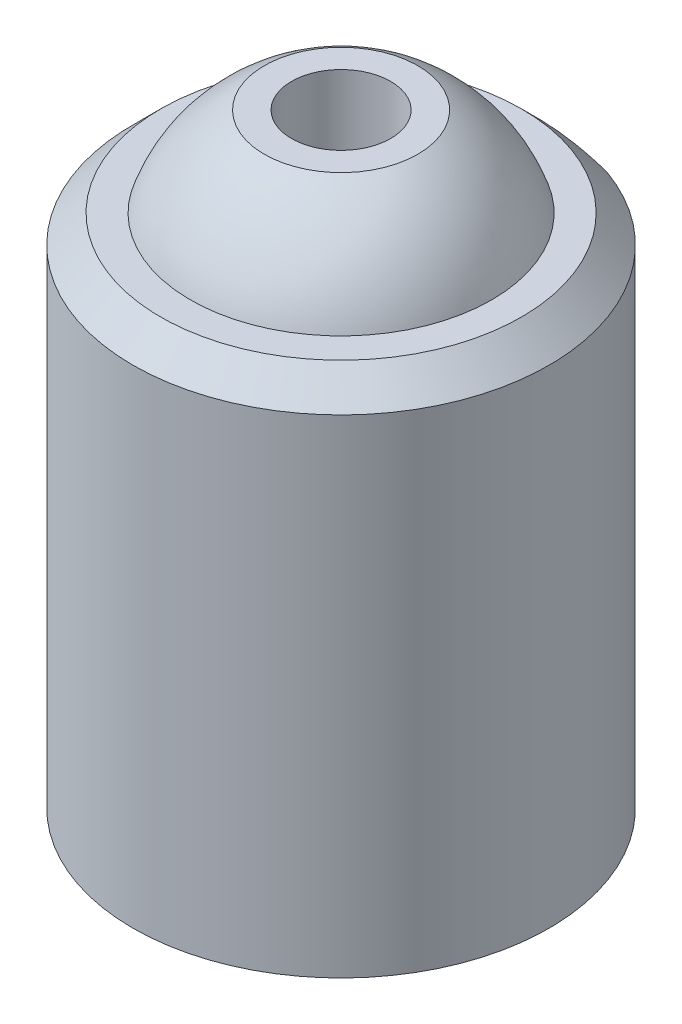
ISO-10303-21;
HEADER;
FILE_DESCRIPTION(('STEP AP214'),'2;1');
FILE_NAME('part.step','',(''),(''),'','','');
FILE_SCHEMA(('AUTOMOTIVE_DESIGN { 1 0 10303 214 1 1 1 1 }'));
ENDSEC;
DATA;
#1=APPLICATION_CONTEXT('core data for automotive mechanical design processes');
#2=APPLICATION_PROTOCOL_DEFINITION('international standard','automotive_design',2000,#1);
#3=PRODUCT_CONTEXT('',#1,'mechanical');
#4=PRODUCT('Part','Part','',(#3));
#5=PRODUCT_RELATED_PRODUCT_CATEGORY('part','',(#4));
#6=PRODUCT_DEFINITION_FORMATION('','',#4);
#7=PRODUCT_DEFINITION_CONTEXT('part definition',#1,'design');
#8=PRODUCT_DEFINITION('design','',#6,#7);
#9=PRODUCT_DEFINITION_SHAPE('','',#8);
#10=(LENGTH_UNIT() NAMED_UNIT(*) SI_UNIT(.MILLI.,.METRE.));
#11=(NAMED_UNIT(*) PLANE_ANGLE_UNIT() SI_UNIT($,.RADIAN.));
#12=(NAMED_UNIT(*) SI_UNIT($,.STERADIAN.) SOLID_ANGLE_UNIT());
#13=UNCERTAINTY_MEASURE_WITH_UNIT(LENGTH_MEASURE(1.E-05),#10,'distance_accuracy_value','');
#14=(GEOMETRIC_REPRESENTATION_CONTEXT(3) GLOBAL_UNCERTAINTY_ASSIGNED_CONTEXT((#13)) GLOBAL_UNIT_ASSIGNED_CONTEXT((#10,
#11,#12)) REPRESENTATION_CONTEXT('',''));
#15=CARTESIAN_POINT('',(0.,0.,0.));
#16=DIRECTION('',(0.,0.,1.));
#17=DIRECTION('',(1.,0.,0.));
#18=AXIS2_PLACEMENT_3D('',#15,#16,#17);
#19=CARTESIAN_POINT('',(0.,33.5828427942722,0.));
#20=DIRECTION('',(0.,1.,0.));
#21=DIRECTION('',(0.,0.,-1.));
#22=AXIS2_PLACEMENT_3D('',#19,#20,#21);
#23=CYLINDRICAL_SURFACE('',#22,10.5);
#24=DIRECTION('',(0.,-1.,0.));
#25=VECTOR('',#24,1.);
#26=CARTESIAN_POINT('',(3.4985711369072,45.,-9.9));
#27=LINE('',#26,#25);
#28=CARTESIAN_POINT('',(3.4985711369072,24.5993420767853,-9.9));
#29=VERTEX_POINT('',#28);
#30=CARTESIAN_POINT('',(3.4985711369072,0.,-9.9));
#31=VERTEX_POINT('',#30);
#32=EDGE_CURVE('E73',#29,#31,#27,.T.);
#33=ORIENTED_EDGE('',*,*,#32,.F.);
#34=CARTESIAN_POINT('',(0.,24.5993420767853,0.));
#35=DIRECTION('',(0.,-1.,0.));
#36=DIRECTION('',(0.,0.,-1.));
#37=AXIS2_PLACEMENT_3D('',#34,#35,#36);
#38=CIRCLE('',#37,10.5);
#39=CARTESIAN_POINT('',(-3.4985711369072,24.5993420767853,-9.9));
#40=VERTEX_POINT('',#39);
#41=EDGE_CURVE('E11',#29,#40,#38,.T.);
#42=ORIENTED_EDGE('',*,*,#41,.T.);
#43=DIRECTION('',(0.,-1.,0.));
#44=VECTOR('',#43,1.);
#45=CARTESIAN_POINT('',(-3.4985711369072,45.,-9.9));
#46=LINE('',#45,#44);
#47=CARTESIAN_POINT('',(-3.4985711369072,0.,-9.9));
#48=VERTEX_POINT('',#47);
#49=EDGE_CURVE('E68',#40,#48,#46,.T.);
#50=ORIENTED_EDGE('',*,*,#49,.T.);
#51=CARTESIAN_POINT('',(0.,0.,0.));
#52=DIRECTION('',(0.,-1.,0.));
#53=DIRECTION('',(0.,0.,-1.));
#54=AXIS2_PLACEMENT_3D('',#51,#52,#53);
#55=CIRCLE('',#54,10.5);
#56=EDGE_CURVE('E66',#31,#48,#55,.T.);
#57=ORIENTED_EDGE('',*,*,#56,.F.);
#58=EDGE_LOOP('',(#33,#42,#50,#57));
#59=FACE_BOUND('',#58,.T.);
#60=ADVANCED_FACE('F39',(#59),#23,.T.);
#61=CARTESIAN_POINT('',(0.,24.5993420767853,0.));
#62=DIRECTION('',(0.,-1.,0.));
#63=DIRECTION('',(0.,0.,1.));
#64=AXIS2_PLACEMENT_3D('',#61,#62,#63);
#65=CONICAL_SURFACE('',#64,10.5,0.785398163397453);
#66=CARTESIAN_POINT('',(0.,26.,0.));
#67=DIRECTION('',(0.,-1.,0.));
#68=DIRECTION('',(0.,0.,-1.));
#69=AXIS2_PLACEMENT_3D('',#66,#67,#68);
#70=CIRCLE('',#69,9.09934207678533);
#71=CARTESIAN_POINT('',(0.,26.,-9.09934207678533));
#72=VERTEX_POINT('',#71);
#73=EDGE_CURVE('E46',#72,#72,#70,.T.);
#74=ORIENTED_EDGE('',*,*,#73,.T.);
#75=EDGE_LOOP('',(#74));
#76=FACE_BOUND('',#75,.T.);
#77=CARTESIAN_POINT('',(10.6347253560614,20.5698072115925,-9.9));
#78=CARTESIAN_POINT('',(10.3534327245152,20.7756370171556,-9.9));
#79=CARTESIAN_POINT('',(10.0703640832947,20.9790886058814,-9.9));
#80=CARTESIAN_POINT('',(9.49994449108002,21.3801096104111,-9.9));
#81=CARTESIAN_POINT('',(9.21259204206175,21.5776768924951,-9.9));
#82=CARTESIAN_POINT('',(8.62992895484494,21.9677607024612,-9.9));
#83=CARTESIAN_POINT('',(8.33456578398147,22.1601990946641,-9.9));
#84=CARTESIAN_POINT('',(7.73818145145608,22.5360694148431,-9.9));
#85=CARTESIAN_POINT('',(7.43716083203955,22.7195021999469,-9.9));
#86=CARTESIAN_POINT('',(6.81469406083715,23.0833782446129,-9.9));
#87=CARTESIAN_POINT('',(6.49294277694404,23.2633028011417,-9.9));
#88=CARTESIAN_POINT('',(5.84122694862456,23.6078923575283,-9.9));
#89=CARTESIAN_POINT('',(5.51126082511532,23.7725543943925,-9.9));
#90=CARTESIAN_POINT('',(4.8437397246116,24.0818679774736,-9.9));
#91=CARTESIAN_POINT('',(4.50622415814122,24.2266037290523,-9.9));
#92=CARTESIAN_POINT('',(3.82186202173466,24.4919263438985,-9.9));
#93=CARTESIAN_POINT('',(3.47501949477547,24.6125234851075,-9.9));
#94=CARTESIAN_POINT('',(2.79385250281583,24.8174746471964,-9.9));
#95=CARTESIAN_POINT('',(2.4600683586249,24.9036003087884,-9.9));
#96=CARTESIAN_POINT('',(1.78586267617628,25.0449497638404,-9.9));
#97=CARTESIAN_POINT('',(1.44544055245254,25.100170818657,-9.9));
#98=CARTESIAN_POINT('',(0.766481206723811,25.1753468762649,-9.9));
#99=CARTESIAN_POINT('',(0.428009473572112,25.1958825052144,-9.9));
#100=CARTESIAN_POINT('',(-0.249245485116191,25.2019946809104,-9.9));
#101=CARTESIAN_POINT('',(-0.588028698156881,25.1875725737329,-9.9));
#102=CARTESIAN_POINT('',(-1.26129292288764,25.1249357300161,-9.9));
#103=CARTESIAN_POINT('',(-1.59578424604384,25.0768294931369,-9.9));
#104=CARTESIAN_POINT('',(-2.25889352555743,24.9501283914096,-9.9));
#105=CARTESIAN_POINT('',(-2.58751044315523,24.8715281890833,-9.9));
#106=CARTESIAN_POINT('',(-3.24258465072016,24.6866622865256,-9.9));
#107=CARTESIAN_POINT('',(-3.56891784814667,24.5799634507927,-9.9));
#108=CARTESIAN_POINT('',(-4.21331233486015,24.3442499311886,-9.9));
#109=CARTESIAN_POINT('',(-4.53137380686518,24.2152357407344,-9.9));
#110=CARTESIAN_POINT('',(-5.10960524225863,23.9610401127193,-9.9));
#111=CARTESIAN_POINT('',(-5.37095090644008,23.8385006629271,-9.9));
#112=CARTESIAN_POINT('',(-5.88838236354608,23.5827256500491,-9.9));
#113=CARTESIAN_POINT('',(-6.14446735015625,23.4494884624364,-9.9));
#114=CARTESIAN_POINT('',(-6.65207092220755,23.1739673421567,-9.9));
#115=CARTESIAN_POINT('',(-6.90358406574976,23.0316734335521,-9.9));
#116=CARTESIAN_POINT('',(-7.40224875665219,22.7396315576672,-9.9));
#117=CARTESIAN_POINT('',(-7.64940005651858,22.589883169245,-9.9));
#118=CARTESIAN_POINT('',(-8.12952153510164,22.290540747204,-9.9));
#119=CARTESIAN_POINT('',(-8.36265205312506,22.1412030478821,-9.9));
#120=CARTESIAN_POINT('',(-8.82571597270232,21.8376413771605,-9.9));
#121=CARTESIAN_POINT('',(-9.05564925485527,21.6834172239775,-9.9));
#122=CARTESIAN_POINT('',(-9.5119045120272,21.3713163542598,-9.9));
#123=CARTESIAN_POINT('',(-9.73823589395235,21.2134533563395,-9.9));
#124=CARTESIAN_POINT('',(-10.1883264619794,20.8941666084075,-9.9));
#125=CARTESIAN_POINT('',(-10.4120860106608,20.7327433699254,-9.9));
#126=CARTESIAN_POINT('',(-10.6347253560614,20.5698072115925,-9.9));
#127=B_SPLINE_CURVE_WITH_KNOTS('',3,(#77,#78,#79,#80,#81,#82,#83,#84,#85,#86,#87,#88,#89,#90,
#91,#92,#93,#94,#95,#96,#97,#98,#99,#100,#101,#102,#103,#104,#105,#106,#107,#108,#109,#110,#111,
#112,#113,#114,#115,#116,#117,#118,#119,#120,#121,#122,#123,#124,#125,#126),.UNSPECIFIED.,.F.,
.F.,(4,2,2,2,2,2,2,2,2,2,2,2,2,2,2,2,2,2,2,2,2,2,2,2,4),(0.,1.04569907568333,2.09177282855905,
3.14920509274946,4.20653651770245,5.3121335945599,6.41794485923903,7.51892944154791,
8.61944423540979,9.65233814197261,10.6853235649965,11.7008391144993,12.7163155613713,
13.728536023536,14.7409337386088,15.7699574429246,16.7989583973096,17.6646310017704,
18.5304353142487,19.3972103881159,20.2640344862624,21.0945455094225,21.9250874651911,
22.7528911838311,23.5805767299358),.UNSPECIFIED.);
#128=EDGE_CURVE('E58',#29,#40,#127,.T.);
#129=ORIENTED_EDGE('',*,*,#128,.T.);
#130=ORIENTED_EDGE('',*,*,#41,.F.);
#131=EDGE_LOOP('',(#129,#130));
#132=FACE_BOUND('',#131,.T.);
#133=ADVANCED_FACE('F92',(#76,#132),#65,.T.);
#134=CARTESIAN_POINT('',(0.,0.,0.));
#135=DIRECTION('',(0.,1.,0.));
#136=DIRECTION('',(0.,0.,-1.));
#137=AXIS2_PLACEMENT_3D('',#134,#135,#136);
#138=PLANE('',#137);
#139=DIRECTION('',(-1.,0.,0.));
#140=VECTOR('',#139,1.);
#141=CARTESIAN_POINT('',(-3.4985711369072,0.,-9.9));
#142=LINE('',#141,#140);
#143=EDGE_CURVE('E53',#31,#48,#142,.T.);
#144=ORIENTED_EDGE('',*,*,#143,.F.);
#145=ORIENTED_EDGE('',*,*,#56,.T.);
#146=EDGE_LOOP('',(#144,#145));
#147=FACE_BOUND('',#146,.T.);
#148=ADVANCED_FACE('F65',(#147),#138,.F.);
#149=CARTESIAN_POINT('',(9.09934207678533,26.,0.));
#150=DIRECTION('',(0.,-1.,0.));
#151=DIRECTION('',(0.,0.,1.));
#152=AXIS2_PLACEMENT_3D('',#149,#150,#151);
#153=PLANE('',#152);
#154=CARTESIAN_POINT('',(0.,26.,0.));
#155=DIRECTION('',(0.,-1.,0.));
#156=DIRECTION('',(0.,0.,-1.));
#157=AXIS2_PLACEMENT_3D('',#154,#155,#156);
#158=CIRCLE('',#157,7.59934207678533);
#159=CARTESIAN_POINT('',(7.59934207678533,26.,0.));
#160=VERTEX_POINT('',#159);
#161=EDGE_CURVE('E240',#160,#160,#158,.T.);
#162=ORIENTED_EDGE('',*,*,#161,.T.);
#163=EDGE_LOOP('',(#162));
#164=FACE_BOUND('',#163,.T.);
#165=ORIENTED_EDGE('',*,*,#73,.F.);
#166=EDGE_LOOP('',(#165));
#167=FACE_BOUND('',#166,.T.);
#168=ADVANCED_FACE('F97',(#164,#167),#153,.F.);
#169=CARTESIAN_POINT('',(0.,23.5,0.));
#170=DIRECTION('',(0.,1.,0.));
#171=DIRECTION('',(1.,0.,0.));
#172=AXIS2_PLACEMENT_3D('',#169,#170,#171);
#173=SPHERICAL_SURFACE('',#172,8.);
#174=CARTESIAN_POINT('',(0.,30.5,0.));
#175=DIRECTION('',(0.,-1.,0.));
#176=DIRECTION('',(0.,0.,-1.));
#177=AXIS2_PLACEMENT_3D('',#174,#175,#176);
#178=CIRCLE('',#177,3.87298334620741);
#179=CARTESIAN_POINT('',(3.87298334620742,30.5,0.));
#180=VERTEX_POINT('',#179);
#181=EDGE_CURVE('E74',#180,#180,#178,.T.);
#182=CARTESIAN_POINT('',(3.87298334620742,30.5,0.));
#183=CARTESIAN_POINT('',(3.92749680128483,30.4698387767501,0.));
#184=CARTESIAN_POINT('',(3.98165778776365,30.439040516417,0.));
#185=CARTESIAN_POINT('',(4.08924557853226,30.3761872722195,0.));
#186=CARTESIAN_POINT('',(4.14267238282204,30.344132288355,0.));
#187=CARTESIAN_POINT('',(4.24876256422074,30.2787829477297,0.));
#188=CARTESIAN_POINT('',(4.30142594132965,30.2454885909689,0.));
#189=CARTESIAN_POINT('',(4.40596054742428,30.1776787154259,0.));
#190=CARTESIAN_POINT('',(4.45783177641001,30.1431631966439,0.));
#191=CARTESIAN_POINT('',(4.56075376889973,30.0729298251962,0.));
#192=CARTESIAN_POINT('',(4.61180453240372,30.0372119725307,0.));
#193=CARTESIAN_POINT('',(4.71305773208981,29.9645934308825,0.));
#194=CARTESIAN_POINT('',(4.76326016827191,29.9276927418998,0.));
#195=CARTESIAN_POINT('',(4.86278931242486,29.8527286672391,0.));
#196=CARTESIAN_POINT('',(4.91211602039572,29.8146652815611,0.));
#197=CARTESIAN_POINT('',(5.00986678576215,29.7373965886779,0.));
#198=CARTESIAN_POINT('',(5.05829084315772,29.6981912814727,0.));
#199=CARTESIAN_POINT('',(5.15420987752725,29.6186601437094,0.));
#200=CARTESIAN_POINT('',(5.20170485450121,29.5783343131512,0.));
#201=CARTESIAN_POINT('',(5.29573980531233,29.4965841385052,0.));
#202=CARTESIAN_POINT('',(5.34227977914949,29.4551597944172,0.));
#203=CARTESIAN_POINT('',(5.43437932220121,29.3712352020843,0.));
#204=CARTESIAN_POINT('',(5.47993889141577,29.3287349538392,0.));
#205=CARTESIAN_POINT('',(5.57005275884344,29.2426817497974,0.));
#206=CARTESIAN_POINT('',(5.61460705705655,29.1991287940007,0.));
#207=CARTESIAN_POINT('',(5.70268606477789,29.1109939460265,0.));
#208=CARTESIAN_POINT('',(5.74621077428612,29.066412053849,0.));
#209=CARTESIAN_POINT('',(5.83220684884325,28.9762436658775,0.));
#210=CARTESIAN_POINT('',(5.87467821389215,28.9306571700834,0.));
#211=CARTESIAN_POINT('',(5.95854441869071,28.8385044559546,0.));
#212=CARTESIAN_POINT('',(5.99993925844038,28.7919382376198,0.));
#213=CARTESIAN_POINT('',(6.08162981936734,28.6978514942175,0.));
#214=CARTESIAN_POINT('',(6.12192554054463,28.6503309691499,0.));
#215=CARTESIAN_POINT('',(6.20139587095178,28.5543615489495,0.));
#216=CARTESIAN_POINT('',(6.24057048018164,28.5059126538167,0.));
#217=CARTESIAN_POINT('',(6.31777720522098,28.4081129368574,0.));
#218=CARTESIAN_POINT('',(6.35580932103045,28.3587621150309,0.));
#219=CARTESIAN_POINT('',(6.4307103013281,28.2591854803264,0.));
#220=CARTESIAN_POINT('',(6.46757916581627,28.2089596674485,0.));
#221=CARTESIAN_POINT('',(6.54013352047217,28.107660463853,0.));
#222=CARTESIAN_POINT('',(6.57581901063989,28.0565870731354,0.));
#223=CARTESIAN_POINT('',(6.64598713954045,27.9536205896798,0.));
#224=CARTESIAN_POINT('',(6.68046977827329,27.9017274969418,0.));
#225=CARTESIAN_POINT('',(6.74821338370549,27.7971499326573,0.));
#226=CARTESIAN_POINT('',(6.78147435040484,27.7444654611108,0.));
#227=CARTESIAN_POINT('',(6.8467564579577,27.638333894355,0.));
#228=CARTESIAN_POINT('',(6.87877759881122,27.5848867991456,0.));
#229=CARTESIAN_POINT('',(6.94156257756145,27.4772591564508,0.));
#230=CARTESIAN_POINT('',(6.97232641545816,27.4230786089653,0.));
#231=CARTESIAN_POINT('',(7.03257999739894,27.3140136334158,0.));
#232=CARTESIAN_POINT('',(7.062069741443,27.2591292053517,0.));
#233=CARTESIAN_POINT('',(7.11975904025639,27.1486864245464,0.));
#234=CARTESIAN_POINT('',(7.14795859502571,27.0931280718051,0.));
#235=CARTESIAN_POINT('',(7.20305212377479,26.9813677652757,0.));
#236=CARTESIAN_POINT('',(7.22994609775455,26.9251658114877,0.));
#237=CARTESIAN_POINT('',(7.28241378702874,26.8121489781397,0.));
#238=CARTESIAN_POINT('',(7.30798750232316,26.7553340985797,0.));
#239=CARTESIAN_POINT('',(7.35780071306823,26.6411224221267,0.));
#240=CARTESIAN_POINT('',(7.38204020851887,26.5837256252336,0.));
#241=CARTESIAN_POINT('',(7.42917176103568,26.468381445277,0.));
#242=CARTESIAN_POINT('',(7.45206381810183,26.4104340622134,0.));
#243=CARTESIAN_POINT('',(7.49648795699265,26.2940203225038,0.));
#244=CARTESIAN_POINT('',(7.51802003881731,26.2355539658577,0.));
#245=CARTESIAN_POINT('',(7.55971263322879,26.1181342460494,0.));
#246=CARTESIAN_POINT('',(7.57987314581561,26.0591808828872,0.));
#247=CARTESIAN_POINT('',(7.59934207678533,26.,0.));
#248=B_SPLINE_CURVE_WITH_KNOTS('',3,(#182,#183,#184,#185,#186,#187,#188,#189,#190,#191,#192,
#193,#194,#195,#196,#197,#198,#199,#200,#201,#202,#203,#204,#205,#206,#207,#208,#209,#210,#211,
#212,#213,#214,#215,#216,#217,#218,#219,#220,#221,#222,#223,#224,#225,#226,#227,#228,#229,#230,
#231,#232,#233,#234,#235,#236,#237,#238,#239,#240,#241,#242,#243,#244,#245,#246,#247),
.UNSPECIFIED.,.F.,.F.,(4,2,2,2,2,2,2,2,2,2,2,2,2,2,2,2,2,2,2,2,2,2,2,2,2,2,2,2,2,2,2,2,4),(0.,
0.186898777500727,0.373797555001451,0.560696332502178,0.747595110002904,0.934493887503631,
1.12139266500436,1.30829144250509,1.49519022000581,1.68208899750654,1.86898777500726,
2.05588655250799,2.24278533000872,2.42968410750944,2.61658288501017,2.8034816625109,
2.99038044001162,3.17727921751235,3.36417799501308,3.5510767725138,3.73797555001453,
3.92487432751526,4.11177310501598,4.29867188251671,4.48557066001744,4.67246943751816,
4.85936821501889,5.04626699251962,5.23316577002034,5.42006454752107,5.6069633250218,
5.79386210252252,5.98076088002325),.UNSPECIFIED.);
#249=EDGE_CURVE('BSEAM100',#180,#160,#248,.T.);
#250=ORIENTED_EDGE('',*,*,#181,.T.);
#251=ORIENTED_EDGE('',*,*,#161,.F.);
#252=ORIENTED_EDGE('',*,*,#249,.T.);
#253=ORIENTED_EDGE('',*,*,#249,.F.);
#254=EDGE_LOOP('',(#250,#252,#251,#253));
#255=FACE_BOUND('',#254,.T.);
#256=ADVANCED_FACE('F100',(#255),#173,.T.);
#257=CARTESIAN_POINT('',(0.,30.5,0.));
#258=DIRECTION('',(0.,-1.,0.));
#259=DIRECTION('',(0.,0.,1.));
#260=AXIS2_PLACEMENT_3D('',#257,#258,#259);
#261=PLANE('',#260);
#262=CARTESIAN_POINT('',(0.,30.5,0.));
#263=DIRECTION('',(0.,-1.,0.));
#264=DIRECTION('',(0.,0.,-1.));
#265=AXIS2_PLACEMENT_3D('',#262,#263,#264);
#266=CIRCLE('',#265,2.5);
#267=CARTESIAN_POINT('',(0.,30.5,-2.5));
#268=VERTEX_POINT('',#267);
#269=EDGE_CURVE('E79',#268,#268,#266,.T.);
#270=ORIENTED_EDGE('',*,*,#269,.T.);
#271=EDGE_LOOP('',(#270));
#272=FACE_BOUND('',#271,.T.);
#273=ORIENTED_EDGE('',*,*,#181,.F.);
#274=EDGE_LOOP('',(#273));
#275=FACE_BOUND('',#274,.T.);
#276=ADVANCED_FACE('F104',(#272,#275),#261,.F.);
#277=CARTESIAN_POINT('',(0.,25.5,0.));
#278=DIRECTION('',(0.,1.,0.));
#279=DIRECTION('',(0.,0.,-1.));
#280=AXIS2_PLACEMENT_3D('',#277,#278,#279);
#281=CYLINDRICAL_SURFACE('',#280,2.5);
#282=CARTESIAN_POINT('',(0.,25.5,0.));
#283=DIRECTION('',(0.,-1.,0.));
#284=DIRECTION('',(0.,0.,-1.));
#285=AXIS2_PLACEMENT_3D('',#282,#283,#284);
#286=CIRCLE('',#285,2.5);
#287=CARTESIAN_POINT('',(0.,25.5,-2.5));
#288=VERTEX_POINT('',#287);
#289=EDGE_CURVE('E75',#288,#288,#286,.T.);
#290=ORIENTED_EDGE('',*,*,#289,.T.);
#291=EDGE_LOOP('',(#290));
#292=FACE_BOUND('',#291,.T.);
#293=ORIENTED_EDGE('',*,*,#269,.F.);
#294=EDGE_LOOP('',(#293));
#295=FACE_BOUND('',#294,.T.);
#296=ADVANCED_FACE('F108',(#292,#295),#281,.F.);
#297=CARTESIAN_POINT('',(0.,25.5,0.));
#298=DIRECTION('',(0.,1.,0.));
#299=DIRECTION('',(0.,0.,-1.));
#300=AXIS2_PLACEMENT_3D('',#297,#298,#299);
#301=PLANE('',#300);
#302=ORIENTED_EDGE('',*,*,#289,.F.);
#303=EDGE_LOOP('',(#302));
#304=FACE_BOUND('',#303,.T.);
#305=ADVANCED_FACE('F113',(#304),#301,.T.);
#306=CARTESIAN_POINT('',(-3.4985711369072,45.,-9.9));
#307=DIRECTION('',(0.,0.,-1.));
#308=DIRECTION('',(1.,0.,0.));
#309=AXIS2_PLACEMENT_3D('',#306,#307,#308);
#310=PLANE('',#309);
#311=CARTESIAN_POINT('',(0.,5.,-9.9));
#312=DIRECTION('',(0.,0.,1.));
#313=DIRECTION('',(1.,0.,0.));
#314=AXIS2_PLACEMENT_3D('',#311,#312,#313);
#315=CIRCLE('',#314,1.25);
#316=CARTESIAN_POINT('',(1.25,5.,-9.9));
#317=VERTEX_POINT('',#316);
#318=EDGE_CURVE('E206',#317,#317,#315,.T.);
#319=ORIENTED_EDGE('',*,*,#318,.T.);
#320=EDGE_LOOP('',(#319));
#321=FACE_BOUND('',#320,.T.);
#322=CARTESIAN_POINT('',(0.,15.,-9.9));
#323=DIRECTION('',(0.,0.,1.));
#324=DIRECTION('',(1.,0.,0.));
#325=AXIS2_PLACEMENT_3D('',#322,#323,#324);
#326=CIRCLE('',#325,1.25);
#327=CARTESIAN_POINT('',(1.25,15.,-9.9));
#328=VERTEX_POINT('',#327);
#329=EDGE_CURVE('E214',#328,#328,#326,.T.);
#330=ORIENTED_EDGE('',*,*,#329,.T.);
#331=EDGE_LOOP('',(#330));
#332=FACE_BOUND('',#331,.T.);
#333=ORIENTED_EDGE('',*,*,#128,.F.);
#334=ORIENTED_EDGE('',*,*,#32,.T.);
#335=ORIENTED_EDGE('',*,*,#143,.T.);
#336=ORIENTED_EDGE('',*,*,#49,.F.);
#337=EDGE_LOOP('',(#333,#334,#335,#336));
#338=FACE_BOUND('',#337,.T.);
#339=ADVANCED_FACE('F77',(#321,#332,#338),#310,.T.);
#340=CARTESIAN_POINT('',(0.,15.,0.100000000000001));
#341=DIRECTION('',(0.,0.,-1.));
#342=DIRECTION('',(1.,0.,0.));
#343=AXIS2_PLACEMENT_3D('',#340,#341,#342);
#344=CYLINDRICAL_SURFACE('',#343,1.25);
#345=CARTESIAN_POINT('',(0.,15.,0.100000000000001));
#346=DIRECTION('',(0.,0.,1.));
#347=DIRECTION('',(1.,0.,0.));
#348=AXIS2_PLACEMENT_3D('',#345,#346,#347);
#349=CIRCLE('',#348,1.25);
#350=CARTESIAN_POINT('',(1.25,15.,0.100000000000001));
#351=VERTEX_POINT('',#350);
#352=EDGE_CURVE('E209',#351,#351,#349,.T.);
#353=ORIENTED_EDGE('',*,*,#352,.T.);
#354=EDGE_LOOP('',(#353));
#355=FACE_BOUND('',#354,.T.);
#356=ORIENTED_EDGE('',*,*,#329,.F.);
#357=EDGE_LOOP('',(#356));
#358=FACE_BOUND('',#357,.T.);
#359=ADVANCED_FACE('F120',(#355,#358),#344,.F.);
#360=CARTESIAN_POINT('',(0.,15.,0.100000000000001));
#361=DIRECTION('',(0.,0.,-1.));
#362=DIRECTION('',(1.,0.,0.));
#363=AXIS2_PLACEMENT_3D('',#360,#361,#362);
#364=PLANE('',#363);
#365=ORIENTED_EDGE('',*,*,#352,.F.);
#366=EDGE_LOOP('',(#365));
#367=FACE_BOUND('',#366,.T.);
#368=ADVANCED_FACE('F171',(#367),#364,.T.);
#369=CARTESIAN_POINT('',(0.,5.,0.100000000000001));
#370=DIRECTION('',(0.,0.,-1.));
#371=DIRECTION('',(1.,0.,0.));
#372=AXIS2_PLACEMENT_3D('',#369,#370,#371);
#373=CYLINDRICAL_SURFACE('',#372,1.25);
#374=CARTESIAN_POINT('',(0.,5.,0.100000000000001));
#375=DIRECTION('',(0.,0.,1.));
#376=DIRECTION('',(1.,0.,0.));
#377=AXIS2_PLACEMENT_3D('',#374,#375,#376);
#378=CIRCLE('',#377,1.25);
#379=CARTESIAN_POINT('',(1.25,5.,0.100000000000001));
#380=VERTEX_POINT('',#379);
#381=EDGE_CURVE('E69',#380,#380,#378,.T.);
#382=ORIENTED_EDGE('',*,*,#381,.T.);
#383=EDGE_LOOP('',(#382));
#384=FACE_BOUND('',#383,.T.);
#385=ORIENTED_EDGE('',*,*,#318,.F.);
#386=EDGE_LOOP('',(#385));
#387=FACE_BOUND('',#386,.T.);
#388=ADVANCED_FACE('F180',(#384,#387),#373,.F.);
#389=CARTESIAN_POINT('',(0.,5.,0.100000000000001));
#390=DIRECTION('',(0.,0.,-1.));
#391=DIRECTION('',(1.,0.,0.));
#392=AXIS2_PLACEMENT_3D('',#389,#390,#391);
#393=PLANE('',#392);
#394=ORIENTED_EDGE('',*,*,#381,.F.);
#395=EDGE_LOOP('',(#394));
#396=FACE_BOUND('',#395,.T.);
#397=ADVANCED_FACE('F190',(#396),#393,.T.);
#398=CLOSED_SHELL('',(#60,#133,#148,#168,#256,#276,#296,#305,#339,#359,#368,#388,#397));
#399=MANIFOLD_SOLID_BREP('B2',#398);
#400=ADVANCED_BREP_SHAPE_REPRESENTATION('',(#18,#399),#14);
#401=SHAPE_DEFINITION_REPRESENTATION(#9,#400);
ENDSEC;
END-ISO-10303-21;
